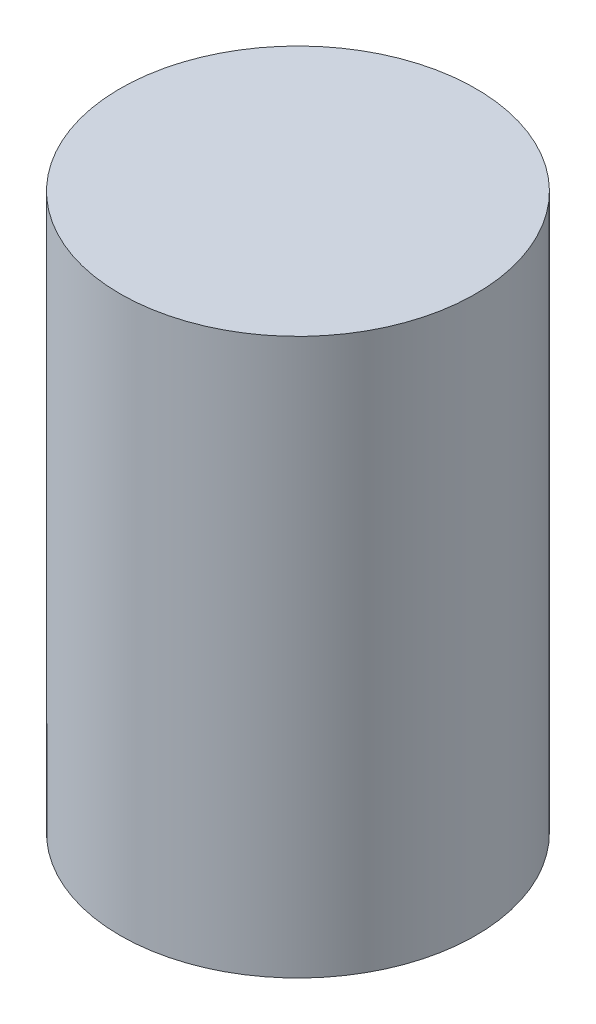
ISO-10303-21;
HEADER;
FILE_DESCRIPTION(('STEP AP214'),'2;1');
FILE_NAME('part.step','',(''),(''),'','','');
FILE_SCHEMA(('AUTOMOTIVE_DESIGN { 1 0 10303 214 1 1 1 1 }'));
ENDSEC;
DATA;
#1=APPLICATION_CONTEXT('core data for automotive mechanical design processes');
#2=APPLICATION_PROTOCOL_DEFINITION('international standard','automotive_design',2000,#1);
#3=PRODUCT_CONTEXT('',#1,'mechanical');
#4=PRODUCT('Part','Part','',(#3));
#5=PRODUCT_RELATED_PRODUCT_CATEGORY('part','',(#4));
#6=PRODUCT_DEFINITION_FORMATION('','',#4);
#7=PRODUCT_DEFINITION_CONTEXT('part definition',#1,'design');
#8=PRODUCT_DEFINITION('design','',#6,#7);
#9=PRODUCT_DEFINITION_SHAPE('','',#8);
#10=(LENGTH_UNIT() NAMED_UNIT(*) SI_UNIT(.MILLI.,.METRE.));
#11=(NAMED_UNIT(*) PLANE_ANGLE_UNIT() SI_UNIT($,.RADIAN.));
#12=(NAMED_UNIT(*) SI_UNIT($,.STERADIAN.) SOLID_ANGLE_UNIT());
#13=UNCERTAINTY_MEASURE_WITH_UNIT(LENGTH_MEASURE(1.E-05),#10,'distance_accuracy_value','');
#14=(GEOMETRIC_REPRESENTATION_CONTEXT(3) GLOBAL_UNCERTAINTY_ASSIGNED_CONTEXT((#13)) GLOBAL_UNIT_ASSIGNED_CONTEXT((#10,
#11,#12)) REPRESENTATION_CONTEXT('',''));
#15=CARTESIAN_POINT('',(0.,0.,0.));
#16=DIRECTION('',(0.,0.,1.));
#17=DIRECTION('',(1.,0.,0.));
#18=AXIS2_PLACEMENT_3D('',#15,#16,#17);
#19=CARTESIAN_POINT('',(0.,250.,0.));
#20=DIRECTION('',(0.,-1.,0.));
#21=DIRECTION('',(0.,0.,-1.));
#22=AXIS2_PLACEMENT_3D('',#19,#20,#21);
#23=CYLINDRICAL_SURFACE('',#22,80.);
#24=CARTESIAN_POINT('',(0.,250.,0.));
#25=DIRECTION('',(0.,1.,0.));
#26=DIRECTION('',(0.,0.,1.));
#27=AXIS2_PLACEMENT_3D('',#24,#25,#26);
#28=CIRCLE('',#27,80.);
#29=CARTESIAN_POINT('',(0.,250.,80.));
#30=VERTEX_POINT('',#29);
#31=EDGE_CURVE('E10',#30,#30,#28,.T.);
#32=ORIENTED_EDGE('',*,*,#31,.F.);
#33=EDGE_LOOP('',(#32));
#34=FACE_BOUND('',#33,.T.);
#35=CARTESIAN_POINT('',(0.,0.,0.));
#36=DIRECTION('',(0.,1.,0.));
#37=DIRECTION('',(0.,0.,1.));
#38=AXIS2_PLACEMENT_3D('',#35,#36,#37);
#39=CIRCLE('',#38,80.);
#40=CARTESIAN_POINT('',(0.,0.,80.));
#41=VERTEX_POINT('',#40);
#42=EDGE_CURVE('E36',#41,#41,#39,.T.);
#43=ORIENTED_EDGE('',*,*,#42,.T.);
#44=EDGE_LOOP('',(#43));
#45=FACE_BOUND('',#44,.T.);
#46=ADVANCED_FACE('F33',(#34,#45),#23,.T.);
#47=CARTESIAN_POINT('',(0.,250.,0.));
#48=DIRECTION('',(0.,1.,0.));
#49=DIRECTION('',(0.,0.,1.));
#50=AXIS2_PLACEMENT_3D('',#47,#48,#49);
#51=PLANE('',#50);
#52=ORIENTED_EDGE('',*,*,#31,.T.);
#53=EDGE_LOOP('',(#52));
#54=FACE_BOUND('',#53,.T.);
#55=ADVANCED_FACE('F48',(#54),#51,.T.);
#56=CARTESIAN_POINT('',(0.,0.,0.));
#57=DIRECTION('',(0.,1.,0.));
#58=DIRECTION('',(0.,0.,1.));
#59=AXIS2_PLACEMENT_3D('',#56,#57,#58);
#60=PLANE('',#59);
#61=ORIENTED_EDGE('',*,*,#42,.F.);
#62=EDGE_LOOP('',(#61));
#63=FACE_BOUND('',#62,.T.);
#64=ADVANCED_FACE('F46',(#63),#60,.F.);
#65=CLOSED_SHELL('',(#46,#55,#64));
#66=MANIFOLD_SOLID_BREP('B2',#65);
#67=ADVANCED_BREP_SHAPE_REPRESENTATION('',(#18,#66),#14);
#68=SHAPE_DEFINITION_REPRESENTATION(#9,#67);
ENDSEC;
END-ISO-10303-21;
